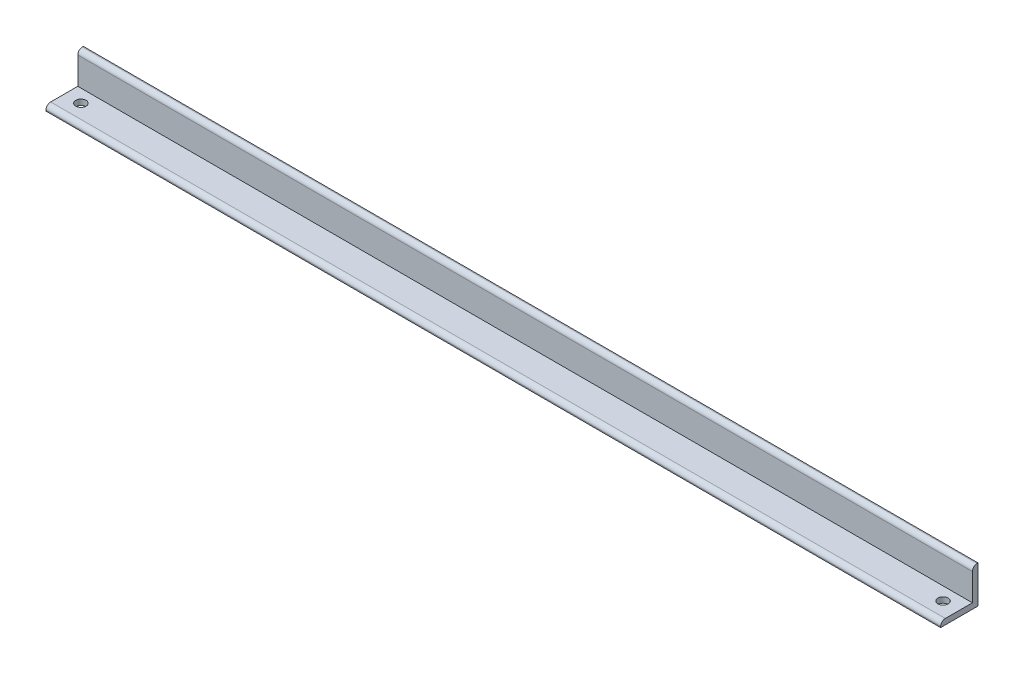
ISO-10303-21;
HEADER;
FILE_DESCRIPTION(('STEP AP214'),'2;1');
FILE_NAME('part.step','',(''),(''),'','','');
FILE_SCHEMA(('AUTOMOTIVE_DESIGN { 1 0 10303 214 1 1 1 1 }'));
ENDSEC;
DATA;
#1=APPLICATION_CONTEXT('core data for automotive mechanical design processes');
#2=APPLICATION_PROTOCOL_DEFINITION('international standard','automotive_design',2000,#1);
#3=PRODUCT_CONTEXT('',#1,'mechanical');
#4=PRODUCT('Part','Part','',(#3));
#5=PRODUCT_RELATED_PRODUCT_CATEGORY('part','',(#4));
#6=PRODUCT_DEFINITION_FORMATION('','',#4);
#7=PRODUCT_DEFINITION_CONTEXT('part definition',#1,'design');
#8=PRODUCT_DEFINITION('design','',#6,#7);
#9=PRODUCT_DEFINITION_SHAPE('','',#8);
#10=(LENGTH_UNIT() NAMED_UNIT(*) SI_UNIT(.MILLI.,.METRE.));
#11=(NAMED_UNIT(*) PLANE_ANGLE_UNIT() SI_UNIT($,.RADIAN.));
#12=(NAMED_UNIT(*) SI_UNIT($,.STERADIAN.) SOLID_ANGLE_UNIT());
#13=UNCERTAINTY_MEASURE_WITH_UNIT(LENGTH_MEASURE(1.E-05),#10,'distance_accuracy_value','');
#14=(GEOMETRIC_REPRESENTATION_CONTEXT(3) GLOBAL_UNCERTAINTY_ASSIGNED_CONTEXT((#13)) GLOBAL_UNIT_ASSIGNED_CONTEXT((#10,
#11,#12)) REPRESENTATION_CONTEXT('',''));
#15=CARTESIAN_POINT('',(0.,0.,0.));
#16=DIRECTION('',(0.,0.,1.));
#17=DIRECTION('',(1.,0.,0.));
#18=AXIS2_PLACEMENT_3D('',#15,#16,#17);
#19=CARTESIAN_POINT('',(0.,0.,80.));
#20=DIRECTION('',(1.,0.,0.));
#21=DIRECTION('',(0.,0.,-1.));
#22=AXIS2_PLACEMENT_3D('',#19,#20,#21);
#23=PLANE('',#22);
#24=DIRECTION('',(0.,-1.,0.));
#25=VECTOR('',#24,1.);
#26=CARTESIAN_POINT('',(0.,0.,80.));
#27=LINE('',#26,#25);
#28=CARTESIAN_POINT('',(0.,2.,80.));
#29=VERTEX_POINT('',#28);
#30=CARTESIAN_POINT('',(0.,0.,80.));
#31=VERTEX_POINT('',#30);
#32=EDGE_CURVE('E126',#29,#31,#27,.T.);
#33=ORIENTED_EDGE('',*,*,#32,.F.);
#34=CARTESIAN_POINT('',(0.,2.,70.));
#35=DIRECTION('',(1.,0.,0.));
#36=DIRECTION('',(0.,0.,-1.));
#37=AXIS2_PLACEMENT_3D('',#34,#35,#36);
#38=CIRCLE('',#37,10.);
#39=CARTESIAN_POINT('',(0.,12.,70.));
#40=VERTEX_POINT('',#39);
#41=EDGE_CURVE('E158',#29,#40,#38,.F.);
#42=ORIENTED_EDGE('',*,*,#41,.T.);
#43=DIRECTION('',(0.,0.,1.));
#44=VECTOR('',#43,1.);
#45=CARTESIAN_POINT('',(0.,12.,12.));
#46=LINE('',#45,#44);
#47=CARTESIAN_POINT('',(0.,12.,12.));
#48=VERTEX_POINT('',#47);
#49=EDGE_CURVE('E105',#48,#40,#46,.T.);
#50=ORIENTED_EDGE('',*,*,#49,.F.);
#51=DIRECTION('',(0.,-1.,0.));
#52=VECTOR('',#51,1.);
#53=CARTESIAN_POINT('',(0.,80.,12.));
#54=LINE('',#53,#52);
#55=CARTESIAN_POINT('',(0.,70.,12.));
#56=VERTEX_POINT('',#55);
#57=EDGE_CURVE('E111',#56,#48,#54,.T.);
#58=ORIENTED_EDGE('',*,*,#57,.F.);
#59=CARTESIAN_POINT('',(0.,70.,2.));
#60=DIRECTION('',(1.,0.,0.));
#61=DIRECTION('',(0.,0.,-1.));
#62=AXIS2_PLACEMENT_3D('',#59,#60,#61);
#63=CIRCLE('',#62,10.);
#64=CARTESIAN_POINT('',(0.,80.,2.));
#65=VERTEX_POINT('',#64);
#66=EDGE_CURVE('E156',#56,#65,#63,.F.);
#67=ORIENTED_EDGE('',*,*,#66,.T.);
#68=DIRECTION('',(0.,0.,-1.));
#69=VECTOR('',#68,1.);
#70=CARTESIAN_POINT('',(0.,80.,80.));
#71=LINE('',#70,#69);
#72=CARTESIAN_POINT('',(0.,80.,0.));
#73=VERTEX_POINT('',#72);
#74=EDGE_CURVE('E134',#65,#73,#71,.T.);
#75=ORIENTED_EDGE('',*,*,#74,.T.);
#76=DIRECTION('',(0.,-1.,0.));
#77=VECTOR('',#76,1.);
#78=CARTESIAN_POINT('',(0.,0.,0.));
#79=LINE('',#78,#77);
#80=CARTESIAN_POINT('',(0.,0.,0.));
#81=VERTEX_POINT('',#80);
#82=EDGE_CURVE('E115',#73,#81,#79,.T.);
#83=ORIENTED_EDGE('',*,*,#82,.T.);
#84=DIRECTION('',(0.,0.,-1.));
#85=VECTOR('',#84,1.);
#86=CARTESIAN_POINT('',(0.,0.,80.));
#87=LINE('',#86,#85);
#88=EDGE_CURVE('E150',#31,#81,#87,.T.);
#89=ORIENTED_EDGE('',*,*,#88,.F.);
#90=EDGE_LOOP('',(#33,#42,#50,#58,#67,#75,#83,#89));
#91=FACE_BOUND('',#90,.T.);
#92=ADVANCED_FACE('F32',(#91),#23,.F.);
#93=CARTESIAN_POINT('',(0.,0.,80.));
#94=DIRECTION('',(0.,1.,0.));
#95=DIRECTION('',(0.,0.,1.));
#96=AXIS2_PLACEMENT_3D('',#93,#94,#95);
#97=PLANE('',#96);
#98=CARTESIAN_POINT('',(1880.13342899247,0.,40.));
#99=DIRECTION('',(0.,-1.,0.));
#100=DIRECTION('',(0.,0.,-1.));
#101=AXIS2_PLACEMENT_3D('',#98,#99,#100);
#102=CIRCLE('',#101,11.);
#103=CARTESIAN_POINT('',(1880.13342899247,0.,29.));
#104=VERTEX_POINT('',#103);
#105=EDGE_CURVE('E172',#104,#104,#102,.T.);
#106=ORIENTED_EDGE('',*,*,#105,.F.);
#107=EDGE_LOOP('',(#106));
#108=FACE_BOUND('',#107,.T.);
#109=CARTESIAN_POINT('',(34.75,0.,40.));
#110=DIRECTION('',(0.,-1.,0.));
#111=DIRECTION('',(0.,0.,-1.));
#112=AXIS2_PLACEMENT_3D('',#109,#110,#111);
#113=CIRCLE('',#112,11.);
#114=CARTESIAN_POINT('',(34.75,0.,29.));
#115=VERTEX_POINT('',#114);
#116=EDGE_CURVE('E165',#115,#115,#113,.T.);
#117=ORIENTED_EDGE('',*,*,#116,.F.);
#118=EDGE_LOOP('',(#117));
#119=FACE_BOUND('',#118,.T.);
#120=DIRECTION('',(1.,0.,0.));
#121=VECTOR('',#120,1.);
#122=CARTESIAN_POINT('',(0.,0.,0.));
#123=LINE('',#122,#121);
#124=CARTESIAN_POINT('',(1915.,0.,0.));
#125=VERTEX_POINT('',#124);
#126=EDGE_CURVE('E137',#81,#125,#123,.T.);
#127=ORIENTED_EDGE('',*,*,#126,.T.);
#128=DIRECTION('',(0.,0.,-1.));
#129=VECTOR('',#128,1.);
#130=CARTESIAN_POINT('',(1915.,0.,80.));
#131=LINE('',#130,#129);
#132=CARTESIAN_POINT('',(1915.,0.,80.));
#133=VERTEX_POINT('',#132);
#134=EDGE_CURVE('E147',#133,#125,#131,.T.);
#135=ORIENTED_EDGE('',*,*,#134,.F.);
#136=DIRECTION('',(1.,0.,0.));
#137=VECTOR('',#136,1.);
#138=CARTESIAN_POINT('',(0.,0.,80.));
#139=LINE('',#138,#137);
#140=EDGE_CURVE('E128',#31,#133,#139,.T.);
#141=ORIENTED_EDGE('',*,*,#140,.F.);
#142=ORIENTED_EDGE('',*,*,#88,.T.);
#143=EDGE_LOOP('',(#127,#135,#141,#142));
#144=FACE_BOUND('',#143,.T.);
#145=ADVANCED_FACE('F180',(#108,#119,#144),#97,.F.);
#146=CARTESIAN_POINT('',(1915.,0.,80.));
#147=DIRECTION('',(-1.,0.,0.));
#148=DIRECTION('',(0.,0.,1.));
#149=AXIS2_PLACEMENT_3D('',#146,#147,#148);
#150=PLANE('',#149);
#151=DIRECTION('',(0.,0.,1.));
#152=VECTOR('',#151,1.);
#153=CARTESIAN_POINT('',(1915.,12.,12.));
#154=LINE('',#153,#152);
#155=CARTESIAN_POINT('',(1915.,12.,12.));
#156=VERTEX_POINT('',#155);
#157=CARTESIAN_POINT('',(1915.,12.,70.));
#158=VERTEX_POINT('',#157);
#159=EDGE_CURVE('E100',#156,#158,#154,.T.);
#160=ORIENTED_EDGE('',*,*,#159,.T.);
#161=CARTESIAN_POINT('',(1915.,2.,70.));
#162=DIRECTION('',(-1.,0.,0.));
#163=DIRECTION('',(0.,0.,1.));
#164=AXIS2_PLACEMENT_3D('',#161,#162,#163);
#165=CIRCLE('',#164,10.);
#166=CARTESIAN_POINT('',(1915.,2.,80.));
#167=VERTEX_POINT('',#166);
#168=EDGE_CURVE('E162',#158,#167,#165,.F.);
#169=ORIENTED_EDGE('',*,*,#168,.T.);
#170=DIRECTION('',(0.,1.,0.));
#171=VECTOR('',#170,1.);
#172=CARTESIAN_POINT('',(1915.,0.,80.));
#173=LINE('',#172,#171);
#174=EDGE_CURVE('E131',#133,#167,#173,.T.);
#175=ORIENTED_EDGE('',*,*,#174,.F.);
#176=ORIENTED_EDGE('',*,*,#134,.T.);
#177=DIRECTION('',(0.,1.,0.));
#178=VECTOR('',#177,1.);
#179=CARTESIAN_POINT('',(1915.,0.,0.));
#180=LINE('',#179,#178);
#181=CARTESIAN_POINT('',(1915.,80.,0.));
#182=VERTEX_POINT('',#181);
#183=EDGE_CURVE('E139',#125,#182,#180,.T.);
#184=ORIENTED_EDGE('',*,*,#183,.T.);
#185=DIRECTION('',(0.,0.,-1.));
#186=VECTOR('',#185,1.);
#187=CARTESIAN_POINT('',(1915.,80.,80.));
#188=LINE('',#187,#186);
#189=CARTESIAN_POINT('',(1915.,80.,2.));
#190=VERTEX_POINT('',#189);
#191=EDGE_CURVE('E145',#190,#182,#188,.T.);
#192=ORIENTED_EDGE('',*,*,#191,.F.);
#193=CARTESIAN_POINT('',(1915.,70.,2.));
#194=DIRECTION('',(-1.,0.,0.));
#195=DIRECTION('',(0.,0.,1.));
#196=AXIS2_PLACEMENT_3D('',#193,#194,#195);
#197=CIRCLE('',#196,10.);
#198=CARTESIAN_POINT('',(1915.,70.,12.));
#199=VERTEX_POINT('',#198);
#200=EDGE_CURVE('E49',#190,#199,#197,.F.);
#201=ORIENTED_EDGE('',*,*,#200,.T.);
#202=DIRECTION('',(0.,-1.,0.));
#203=VECTOR('',#202,1.);
#204=CARTESIAN_POINT('',(1915.,80.,12.));
#205=LINE('',#204,#203);
#206=EDGE_CURVE('E96',#199,#156,#205,.T.);
#207=ORIENTED_EDGE('',*,*,#206,.T.);
#208=EDGE_LOOP('',(#160,#169,#175,#176,#184,#192,#201,#207));
#209=FACE_BOUND('',#208,.T.);
#210=ADVANCED_FACE('F98',(#209),#150,.F.);
#211=CARTESIAN_POINT('',(0.,80.,80.));
#212=DIRECTION('',(0.,-1.,0.));
#213=DIRECTION('',(0.,0.,-1.));
#214=AXIS2_PLACEMENT_3D('',#211,#212,#213);
#215=PLANE('',#214);
#216=ORIENTED_EDGE('',*,*,#74,.F.);
#217=DIRECTION('',(-1.,0.,0.));
#218=VECTOR('',#217,1.);
#219=CARTESIAN_POINT('',(0.,80.,2.));
#220=LINE('',#219,#218);
#221=EDGE_CURVE('E11',#65,#190,#220,.F.);
#222=ORIENTED_EDGE('',*,*,#221,.T.);
#223=ORIENTED_EDGE('',*,*,#191,.T.);
#224=DIRECTION('',(-1.,0.,0.));
#225=VECTOR('',#224,1.);
#226=CARTESIAN_POINT('',(0.,80.,0.));
#227=LINE('',#226,#225);
#228=EDGE_CURVE('E129',#182,#73,#227,.T.);
#229=ORIENTED_EDGE('',*,*,#228,.T.);
#230=EDGE_LOOP('',(#216,#222,#223,#229));
#231=FACE_BOUND('',#230,.T.);
#232=ADVANCED_FACE('F194',(#231),#215,.F.);
#233=CARTESIAN_POINT('',(0.,80.,80.));
#234=DIRECTION('',(0.,0.,-1.));
#235=DIRECTION('',(-1.,0.,0.));
#236=AXIS2_PLACEMENT_3D('',#233,#234,#235);
#237=PLANE('',#236);
#238=ORIENTED_EDGE('',*,*,#174,.T.);
#239=DIRECTION('',(-1.,0.,0.));
#240=VECTOR('',#239,1.);
#241=CARTESIAN_POINT('',(0.,2.,80.));
#242=LINE('',#241,#240);
#243=EDGE_CURVE('E153',#167,#29,#242,.T.);
#244=ORIENTED_EDGE('',*,*,#243,.T.);
#245=ORIENTED_EDGE('',*,*,#32,.T.);
#246=ORIENTED_EDGE('',*,*,#140,.T.);
#247=EDGE_LOOP('',(#238,#244,#245,#246));
#248=FACE_BOUND('',#247,.T.);
#249=ADVANCED_FACE('F202',(#248),#237,.F.);
#250=CARTESIAN_POINT('',(0.,80.,0.));
#251=DIRECTION('',(0.,0.,-1.));
#252=DIRECTION('',(-1.,0.,0.));
#253=AXIS2_PLACEMENT_3D('',#250,#251,#252);
#254=PLANE('',#253);
#255=ORIENTED_EDGE('',*,*,#82,.F.);
#256=ORIENTED_EDGE('',*,*,#228,.F.);
#257=ORIENTED_EDGE('',*,*,#183,.F.);
#258=ORIENTED_EDGE('',*,*,#126,.F.);
#259=EDGE_LOOP('',(#255,#256,#257,#258));
#260=FACE_BOUND('',#259,.T.);
#261=ADVANCED_FACE('F193',(#260),#254,.T.);
#262=CARTESIAN_POINT('',(1915.,80.,12.));
#263=DIRECTION('',(0.,0.,-1.));
#264=DIRECTION('',(0.,1.,0.));
#265=AXIS2_PLACEMENT_3D('',#262,#263,#264);
#266=PLANE('',#265);
#267=ORIENTED_EDGE('',*,*,#206,.F.);
#268=DIRECTION('',(-1.,0.,0.));
#269=VECTOR('',#268,1.);
#270=CARTESIAN_POINT('',(1915.,70.,12.));
#271=LINE('',#270,#269);
#272=EDGE_CURVE('E41',#199,#56,#271,.T.);
#273=ORIENTED_EDGE('',*,*,#272,.T.);
#274=ORIENTED_EDGE('',*,*,#57,.T.);
#275=DIRECTION('',(-1.,0.,0.));
#276=VECTOR('',#275,1.);
#277=CARTESIAN_POINT('',(1915.,12.,12.));
#278=LINE('',#277,#276);
#279=EDGE_CURVE('E108',#156,#48,#278,.T.);
#280=ORIENTED_EDGE('',*,*,#279,.F.);
#281=EDGE_LOOP('',(#267,#273,#274,#280));
#282=FACE_BOUND('',#281,.T.);
#283=ADVANCED_FACE('F109',(#282),#266,.F.);
#284=CARTESIAN_POINT('',(1915.,12.,12.));
#285=DIRECTION('',(0.,-1.,0.));
#286=DIRECTION('',(0.,0.,-1.));
#287=AXIS2_PLACEMENT_3D('',#284,#285,#286);
#288=PLANE('',#287);
#289=CARTESIAN_POINT('',(1880.13342899247,12.,40.));
#290=DIRECTION('',(0.,-1.,0.));
#291=DIRECTION('',(0.,0.,-1.));
#292=AXIS2_PLACEMENT_3D('',#289,#290,#291);
#293=CIRCLE('',#292,11.);
#294=CARTESIAN_POINT('',(1880.13342899247,12.,29.));
#295=VERTEX_POINT('',#294);
#296=EDGE_CURVE('E36',#295,#295,#293,.T.);
#297=ORIENTED_EDGE('',*,*,#296,.T.);
#298=EDGE_LOOP('',(#297));
#299=FACE_BOUND('',#298,.T.);
#300=CARTESIAN_POINT('',(34.75,12.,40.));
#301=DIRECTION('',(0.,-1.,0.));
#302=DIRECTION('',(0.,0.,-1.));
#303=AXIS2_PLACEMENT_3D('',#300,#301,#302);
#304=CIRCLE('',#303,11.);
#305=CARTESIAN_POINT('',(34.75,12.,29.));
#306=VERTEX_POINT('',#305);
#307=EDGE_CURVE('E124',#306,#306,#304,.T.);
#308=ORIENTED_EDGE('',*,*,#307,.T.);
#309=EDGE_LOOP('',(#308));
#310=FACE_BOUND('',#309,.T.);
#311=ORIENTED_EDGE('',*,*,#49,.T.);
#312=DIRECTION('',(-1.,0.,0.));
#313=VECTOR('',#312,1.);
#314=CARTESIAN_POINT('',(1915.,12.,70.));
#315=LINE('',#314,#313);
#316=EDGE_CURVE('E119',#40,#158,#315,.F.);
#317=ORIENTED_EDGE('',*,*,#316,.T.);
#318=ORIENTED_EDGE('',*,*,#159,.F.);
#319=ORIENTED_EDGE('',*,*,#279,.T.);
#320=EDGE_LOOP('',(#311,#317,#318,#319));
#321=FACE_BOUND('',#320,.T.);
#322=ADVANCED_FACE('F117',(#299,#310,#321),#288,.F.);
#323=CARTESIAN_POINT('',(0.,2.,70.));
#324=DIRECTION('',(-1.,0.,0.));
#325=DIRECTION('',(0.,0.,1.));
#326=AXIS2_PLACEMENT_3D('',#323,#324,#325);
#327=CYLINDRICAL_SURFACE('',#326,10.);
#328=ORIENTED_EDGE('',*,*,#168,.F.);
#329=ORIENTED_EDGE('',*,*,#316,.F.);
#330=ORIENTED_EDGE('',*,*,#41,.F.);
#331=ORIENTED_EDGE('',*,*,#243,.F.);
#332=EDGE_LOOP('',(#328,#329,#330,#331));
#333=FACE_BOUND('',#332,.T.);
#334=ADVANCED_FACE('F199',(#333),#327,.T.);
#335=CARTESIAN_POINT('',(1915.,70.,2.));
#336=DIRECTION('',(-1.,0.,0.));
#337=DIRECTION('',(0.,0.,1.));
#338=AXIS2_PLACEMENT_3D('',#335,#336,#337);
#339=CYLINDRICAL_SURFACE('',#338,10.);
#340=ORIENTED_EDGE('',*,*,#200,.F.);
#341=ORIENTED_EDGE('',*,*,#221,.F.);
#342=ORIENTED_EDGE('',*,*,#66,.F.);
#343=ORIENTED_EDGE('',*,*,#272,.F.);
#344=EDGE_LOOP('',(#340,#341,#342,#343));
#345=FACE_BOUND('',#344,.T.);
#346=ADVANCED_FACE('F34',(#345),#339,.T.);
#347=CARTESIAN_POINT('',(34.75,80.,40.));
#348=DIRECTION('',(0.,-1.,0.));
#349=DIRECTION('',(0.,0.,-1.));
#350=AXIS2_PLACEMENT_3D('',#347,#348,#349);
#351=CYLINDRICAL_SURFACE('',#350,11.);
#352=ORIENTED_EDGE('',*,*,#116,.T.);
#353=EDGE_LOOP('',(#352));
#354=FACE_BOUND('',#353,.T.);
#355=ORIENTED_EDGE('',*,*,#307,.F.);
#356=EDGE_LOOP('',(#355));
#357=FACE_BOUND('',#356,.T.);
#358=ADVANCED_FACE('F222',(#354,#357),#351,.F.);
#359=CARTESIAN_POINT('',(1880.13342899247,80.,40.));
#360=DIRECTION('',(0.,-1.,0.));
#361=DIRECTION('',(0.,0.,-1.));
#362=AXIS2_PLACEMENT_3D('',#359,#360,#361);
#363=CYLINDRICAL_SURFACE('',#362,11.);
#364=ORIENTED_EDGE('',*,*,#105,.T.);
#365=EDGE_LOOP('',(#364));
#366=FACE_BOUND('',#365,.T.);
#367=ORIENTED_EDGE('',*,*,#296,.F.);
#368=EDGE_LOOP('',(#367));
#369=FACE_BOUND('',#368,.T.);
#370=ADVANCED_FACE('F177',(#366,#369),#363,.F.);
#371=CLOSED_SHELL('',(#92,#145,#210,#232,#249,#261,#283,#322,#334,#346,#358,#370));
#372=MANIFOLD_SOLID_BREP('B2',#371);
#373=ADVANCED_BREP_SHAPE_REPRESENTATION('',(#18,#372),#14);
#374=SHAPE_DEFINITION_REPRESENTATION(#9,#373);
ENDSEC;
END-ISO-10303-21;
